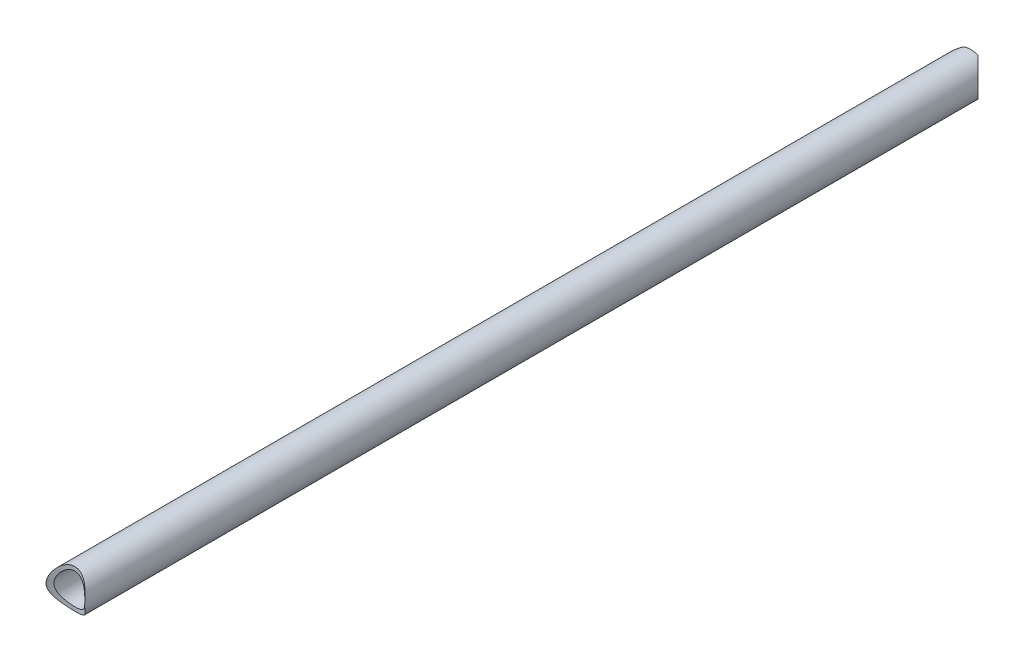
ISO-10303-21;
HEADER;
FILE_DESCRIPTION(('STEP AP214'),'2;1');
FILE_NAME('part.step','',(''),(''),'','','');
FILE_SCHEMA(('AUTOMOTIVE_DESIGN { 1 0 10303 214 1 1 1 1 }'));
ENDSEC;
DATA;
#1=APPLICATION_CONTEXT('core data for automotive mechanical design processes');
#2=APPLICATION_PROTOCOL_DEFINITION('international standard','automotive_design',2000,#1);
#3=PRODUCT_CONTEXT('',#1,'mechanical');
#4=PRODUCT('Part','Part','',(#3));
#5=PRODUCT_RELATED_PRODUCT_CATEGORY('part','',(#4));
#6=PRODUCT_DEFINITION_FORMATION('','',#4);
#7=PRODUCT_DEFINITION_CONTEXT('part definition',#1,'design');
#8=PRODUCT_DEFINITION('design','',#6,#7);
#9=PRODUCT_DEFINITION_SHAPE('','',#8);
#10=(LENGTH_UNIT() NAMED_UNIT(*) SI_UNIT(.MILLI.,.METRE.));
#11=(NAMED_UNIT(*) PLANE_ANGLE_UNIT() SI_UNIT($,.RADIAN.));
#12=(NAMED_UNIT(*) SI_UNIT($,.STERADIAN.) SOLID_ANGLE_UNIT());
#13=UNCERTAINTY_MEASURE_WITH_UNIT(LENGTH_MEASURE(1.E-05),#10,'distance_accuracy_value','');
#14=(GEOMETRIC_REPRESENTATION_CONTEXT(3) GLOBAL_UNCERTAINTY_ASSIGNED_CONTEXT((#13)) GLOBAL_UNIT_ASSIGNED_CONTEXT((#10,
#11,#12)) REPRESENTATION_CONTEXT('',''));
#15=CARTESIAN_POINT('',(0.,0.,0.));
#16=DIRECTION('',(0.,0.,1.));
#17=DIRECTION('',(1.,0.,0.));
#18=AXIS2_PLACEMENT_3D('',#15,#16,#17);
#19=CARTESIAN_POINT('',(6.35,16.7005,6.35));
#20=DIRECTION('',(0.,0.,1.));
#21=DIRECTION('',(1.,0.,0.));
#22=AXIS2_PLACEMENT_3D('',#19,#20,#21);
#23=PLANE('',#22);
#24=CARTESIAN_POINT('',(0.,0.,6.35));
#25=DIRECTION('',(0.,0.,1.));
#26=DIRECTION('',(1.,0.,0.));
#27=AXIS2_PLACEMENT_3D('',#24,#25,#26);
#28=CIRCLE('',#27,16.7005);
#29=CARTESIAN_POINT('',(-6.35,-15.4461710546659,6.35));
#30=VERTEX_POINT('',#29);
#31=CARTESIAN_POINT('',(6.35,-15.4461710546659,6.35));
#32=VERTEX_POINT('',#31);
#33=EDGE_CURVE('E60',#30,#32,#28,.T.);
#34=ORIENTED_EDGE('',*,*,#33,.F.);
#35=DIRECTION('',(1.,0.,0.));
#36=VECTOR('',#35,1.);
#37=CARTESIAN_POINT('',(-16.7005,-15.4461710546659,6.35));
#38=LINE('',#37,#36);
#39=EDGE_CURVE('E38',#32,#30,#38,.F.);
#40=ORIENTED_EDGE('',*,*,#39,.F.);
#41=EDGE_LOOP('',(#34,#40));
#42=FACE_BOUND('',#41,.T.);
#43=ADVANCED_FACE('F16',(#42),#23,.F.);
#44=CARTESIAN_POINT('',(6.35,16.7005,6.35));
#45=DIRECTION('',(0.,0.,1.));
#46=DIRECTION('',(1.,0.,0.));
#47=AXIS2_PLACEMENT_3D('',#44,#45,#46);
#48=PLANE('',#47);
#49=DIRECTION('',(1.,0.,0.));
#50=VECTOR('',#49,1.);
#51=CARTESIAN_POINT('',(-16.7005,15.4461710546659,6.35));
#52=LINE('',#51,#50);
#53=CARTESIAN_POINT('',(-6.35,15.4461710546659,6.35));
#54=VERTEX_POINT('',#53);
#55=CARTESIAN_POINT('',(6.35,15.4461710546659,6.35));
#56=VERTEX_POINT('',#55);
#57=EDGE_CURVE('E46',#54,#56,#52,.T.);
#58=ORIENTED_EDGE('',*,*,#57,.F.);
#59=CARTESIAN_POINT('',(0.,0.,6.35));
#60=DIRECTION('',(0.,0.,1.));
#61=DIRECTION('',(1.,0.,0.));
#62=AXIS2_PLACEMENT_3D('',#59,#60,#61);
#63=CIRCLE('',#62,16.7005);
#64=EDGE_CURVE('E29',#56,#54,#63,.T.);
#65=ORIENTED_EDGE('',*,*,#64,.F.);
#66=EDGE_LOOP('',(#58,#65));
#67=FACE_BOUND('',#66,.T.);
#68=ADVANCED_FACE('F55',(#67),#48,.F.);
#69=CARTESIAN_POINT('',(0.,0.,0.));
#70=DIRECTION('',(0.,0.,1.));
#71=DIRECTION('',(1.,0.,0.));
#72=AXIS2_PLACEMENT_3D('',#69,#70,#71);
#73=CYLINDRICAL_SURFACE('',#72,16.7005);
#74=CARTESIAN_POINT('',(-16.7005,0.,787.233608751868));
#75=CARTESIAN_POINT('',(-16.700501651617,-0.318048689825917,787.233612608257));
#76=CARTESIAN_POINT('',(-16.6913959959469,-0.636078058233083,787.221766271706));
#77=CARTESIAN_POINT('',(-16.6552091317132,-1.26936872938501,787.175000935832));
#78=CARTESIAN_POINT('',(-16.6281288319816,-1.58463017126485,787.140083103047));
#79=CARTESIAN_POINT('',(-16.5565522230821,-2.21059640241424,787.048768533877));
#80=CARTESIAN_POINT('',(-16.5120227972951,-2.52129135473045,786.99233096079));
#81=CARTESIAN_POINT('',(-16.406435560555,-3.13573086215763,786.860411205657));
#82=CARTESIAN_POINT('',(-16.3453749130287,-3.43947421474204,786.78492575536));
#83=CARTESIAN_POINT('',(-16.1842492768174,-4.14084876098794,786.589195163801));
#84=CARTESIAN_POINT('',(-16.077982364405,-4.53524728481024,786.462460291712));
#85=CARTESIAN_POINT('',(-15.8396836474816,-5.30799392340747,786.186396495594));
#86=CARTESIAN_POINT('',(-15.7076417804045,-5.68633569915747,786.037058752514));
#87=CARTESIAN_POINT('',(-15.4192499567053,-6.42743384951331,785.721430967993));
#88=CARTESIAN_POINT('',(-15.2628423194377,-6.79015056507846,785.555101031414));
#89=CARTESIAN_POINT('',(-14.9272840463479,-7.49911362250992,785.210919182502));
#90=CARTESIAN_POINT('',(-14.7481336137038,-7.8453601114789,785.033067373109));
#91=CARTESIAN_POINT('',(-14.3024041651075,-8.6382984028996,784.607526750598));
#92=CARTESIAN_POINT('',(-14.0269775406112,-9.07846296782937,784.356901101039));
#93=CARTESIAN_POINT('',(-13.4378225813671,-9.92973408775896,783.851105361308));
#94=CARTESIAN_POINT('',(-13.1240811814276,-10.3408306548058,783.595933746457));
#95=CARTESIAN_POINT('',(-12.4592472119749,-11.1328767461881,783.08845490054));
#96=CARTESIAN_POINT('',(-12.1081844373138,-11.5138499015276,782.836145559907));
#97=CARTESIAN_POINT('',(-11.3689722747507,-12.2443047785302,782.340633446549));
#98=CARTESIAN_POINT('',(-10.9808349094774,-12.5937966380637,782.097427757041));
#99=CARTESIAN_POINT('',(-10.246856978174,-13.1942295023333,781.671867202713));
#100=CARTESIAN_POINT('',(-9.90742040228809,-13.4511353391158,781.486861072064));
#101=CARTESIAN_POINT('',(-9.2052426848626,-13.9410699521921,781.129778171846));
#102=CARTESIAN_POINT('',(-8.84250262469104,-14.1740998351183,780.957700803138));
#103=CARTESIAN_POINT('',(-8.09505502437905,-14.6138480285564,780.629839586845));
#104=CARTESIAN_POINT('',(-7.71037556823541,-14.8205989295075,780.474035601102));
#105=CARTESIAN_POINT('',(-6.92003928515725,-15.2056855933979,780.181636648248));
#106=CARTESIAN_POINT('',(-6.51438587820199,-15.3840259696791,780.045038562877));
#107=CARTESIAN_POINT('',(-5.75026126756027,-15.683807125484,779.814088012563));
#108=CARTESIAN_POINT('',(-5.39455250044626,-15.8097863364325,779.716471964176));
#109=CARTESIAN_POINT('',(-4.67143177476955,-16.0383338840936,779.53870105387));
#110=CARTESIAN_POINT('',(-4.30402100750052,-16.1409045952257,779.45854442101));
#111=CARTESIAN_POINT('',(-3.55969655452298,-16.3212078930991,779.31724958533));
#112=CARTESIAN_POINT('',(-3.18278649496969,-16.3989498072969,779.25610424075));
#113=CARTESIAN_POINT('',(-2.42180325024312,-16.5284760682203,779.154046874769));
#114=CARTESIAN_POINT('',(-2.03772997888543,-16.5802601024235,779.113135096972));
#115=CARTESIAN_POINT('',(-1.2639485361398,-16.6571543818868,779.052333662823));
#116=CARTESIAN_POINT('',(-0.874225795711782,-16.6821746677361,779.032514906316));
#117=CARTESIAN_POINT('',(-0.0934815880961755,-16.7048039829193,779.014591498827));
#118=CARTESIAN_POINT('',(0.297539881527401,-16.7024129608096,779.016486888595));
#119=CARTESIAN_POINT('',(1.0777582290705,-16.670260832553,779.041948698987));
#120=CARTESIAN_POINT('',(1.46695501820657,-16.6404984082069,779.065516163332));
#121=CARTESIAN_POINT('',(2.24046061871693,-16.5541076339679,779.133793779299));
#122=CARTESIAN_POINT('',(2.6247695313816,-16.4974798417346,779.178503492059));
#123=CARTESIAN_POINT('',(3.36595716497829,-16.3618931457417,779.285247485782));
#124=CARTESIAN_POINT('',(3.72322478696736,-16.2842447345686,779.346262989482));
#125=CARTESIAN_POINT('',(4.42876565574082,-16.1066776484362,779.485295562696));
#126=CARTESIAN_POINT('',(4.77703928705755,-16.0067599273521,779.563311904001));
#127=CARTESIAN_POINT('',(5.46288298696905,-15.7858617455712,779.735014684873));
#128=CARTESIAN_POINT('',(5.80045212790353,-15.6648794652667,779.828702478151));
#129=CARTESIAN_POINT('',(6.46349157949884,-15.4031504972252,780.030269017966));
#130=CARTESIAN_POINT('',(6.78896023061735,-15.2624011110486,780.13814970187));
#131=CARTESIAN_POINT('',(7.45803660736234,-14.9477144408192,780.377759231156));
#132=CARTESIAN_POINT('',(7.80028273182768,-14.771874867815,780.510789894612));
#133=CARTESIAN_POINT('',(8.46779474930284,-14.3996258832921,780.789948530501));
#134=CARTESIAN_POINT('',(8.79305971576122,-14.2032153511039,780.936077216429));
#135=CARTESIAN_POINT('',(9.42603574881754,-13.791272704257,781.239358926914));
#136=CARTESIAN_POINT('',(9.7337397651196,-13.5757329972033,781.396516323554));
#137=CARTESIAN_POINT('',(10.3310355839786,-13.1269183916845,781.719690906607));
#138=CARTESIAN_POINT('',(10.6206253345675,-12.8936414905733,781.885709092827));
#139=CARTESIAN_POINT('',(11.2389465364587,-12.360896534547,782.259242496426));
#140=CARTESIAN_POINT('',(11.5635215076673,-12.0576666498107,782.468284177876));
#141=CARTESIAN_POINT('',(12.1856888122492,-11.4285380286701,782.892400312314));
#142=CARTESIAN_POINT('',(12.483276565549,-11.1026354609469,783.107475781233));
#143=CARTESIAN_POINT('',(13.0514882835474,-10.4287970356688,783.539898685134));
#144=CARTESIAN_POINT('',(13.3220829665062,-10.0808379062256,783.757248310771));
#145=CARTESIAN_POINT('',(13.8355433882296,-9.36370199013703,784.18959328861));
#146=CARTESIAN_POINT('',(14.0784128552644,-8.99452806635247,784.404588953832));
#147=CARTESIAN_POINT('',(14.5090787381798,-8.2792904513633,784.802516138416));
#148=CARTESIAN_POINT('',(14.6999945759619,-7.93555716771788,784.986261646823));
#149=CARTESIAN_POINT('',(15.0589359152759,-7.23127694571284,785.343871395788));
#150=CARTESIAN_POINT('',(15.2269593605258,-6.87072850085056,785.517734747875));
#151=CARTESIAN_POINT('',(15.5386367295555,-6.13330543738908,785.850321277235));
#152=CARTESIAN_POINT('',(15.6823324945151,-5.75646027869634,786.009070239584));
#153=CARTESIAN_POINT('',(15.944006998122,-4.98604647831984,786.305852276331));
#154=CARTESIAN_POINT('',(16.0619965058618,-4.592484922507,786.443894018002));
#155=CARTESIAN_POINT('',(16.2405793140074,-3.90364687412955,786.65723914812));
#156=CARTESIAN_POINT('',(16.307957215658,-3.61219218652718,786.73922737682));
#157=CARTESIAN_POINT('',(16.4275469470861,-3.02208006034204,786.886543316729));
#158=CARTESIAN_POINT('',(16.4797635271719,-2.72342490962231,786.951876245551));
#159=CARTESIAN_POINT('',(16.5680987875878,-2.12070532915112,787.063363065291));
#160=CARTESIAN_POINT('',(16.604244860437,-1.81665102975393,787.109549582514));
#161=CARTESIAN_POINT('',(16.6598377177618,-1.204542646993,787.18092116107));
#162=CARTESIAN_POINT('',(16.6792847988268,-0.896488634766468,787.206106595402));
#163=CARTESIAN_POINT('',(16.7010868754288,-0.27721920419052,787.234357635925));
#164=CARTESIAN_POINT('',(16.7033569139518,0.0340043141999709,787.237313294035));
#165=CARTESIAN_POINT('',(16.6905260764593,0.655473620640881,787.220669011924));
#166=CARTESIAN_POINT('',(16.6754253802914,0.965719418780765,787.20106930523));
#167=CARTESIAN_POINT('',(16.6281800817812,1.58313609121259,787.14022308628));
#168=CARTESIAN_POINT('',(16.596014116721,1.89030261864608,787.098949442725));
#169=CARTESIAN_POINT('',(16.515310333516,2.49911581309074,786.996585629541));
#170=CARTESIAN_POINT('',(16.4667700170888,2.8007616303827,786.935492436038));
#171=CARTESIAN_POINT('',(16.3387002130721,3.47895656814936,786.776687297342));
#172=CARTESIAN_POINT('',(16.2543206410225,3.85331486677389,786.673526126487));
#173=CARTESIAN_POINT('',(16.0622126684386,4.58875099136022,786.444292077627));
#174=CARTESIAN_POINT('',(15.9544766542316,4.94982444176102,786.318211730657));
#175=CARTESIAN_POINT('',(15.7170466761651,5.65872926612367,786.048040659711));
#176=CARTESIAN_POINT('',(15.5873007902475,6.00652688857554,785.903907564068));
#177=CARTESIAN_POINT('',(15.3073659836329,6.68781696743425,785.602496269669));
#178=CARTESIAN_POINT('',(15.1571762718318,7.02130886960294,785.445217562317));
#179=CARTESIAN_POINT('',(14.7692272097316,7.81315039908073,785.052551196056));
#180=CARTESIAN_POINT('',(14.5214022213875,8.26423493376892,784.812408178419));
#181=CARTESIAN_POINT('',(13.9879350069464,9.13819282319567,784.322811330772));
#182=CARTESIAN_POINT('',(13.7022784892393,9.56105542529527,784.073354007798));
#183=CARTESIAN_POINT('',(13.0938498051449,10.3787116126544,783.572530974422));
#184=CARTESIAN_POINT('',(12.7710445709026,10.7734796758603,783.321163752714));
#185=CARTESIAN_POINT('',(12.0890683367024,11.5335054910506,782.823327409082));
#186=CARTESIAN_POINT('',(11.7299026813521,11.8987675659614,782.576857573646));
#187=CARTESIAN_POINT('',(10.9715181600409,12.601687953773,782.092192401959));
#188=CARTESIAN_POINT('',(10.5719158223075,12.9390134279921,781.854112162494));
#189=CARTESIAN_POINT('',(9.73647589874631,13.5788301252783,781.394945742053));
#190=CARTESIAN_POINT('',(9.30063288274637,13.8813161118687,781.173862117374));
#191=CARTESIAN_POINT('',(8.39513210989652,14.4468801952228,780.755224636954));
#192=CARTESIAN_POINT('',(7.92557163567191,14.7100654137341,780.557607132911));
#193=CARTESIAN_POINT('',(7.19731935840765,15.0724532868862,780.282918663177));
#194=CARTESIAN_POINT('',(6.95062350463152,15.1878355139333,780.194990772289));
#195=CARTESIAN_POINT('',(6.44953596791651,15.4073034317559,780.027032514253));
#196=CARTESIAN_POINT('',(6.19514252203695,15.5113865093175,779.947003974415));
#197=CARTESIAN_POINT('',(5.58850270960068,15.742123762028,779.768955814078));
#198=CARTESIAN_POINT('',(5.23330546142896,15.8638435230263,779.674506430721));
#199=CARTESIAN_POINT('',(4.51172820359068,16.0839438789019,779.503094628227));
#200=CARTESIAN_POINT('',(4.14535110562109,16.1823304931231,779.426127699289));
#201=CARTESIAN_POINT('',(3.40359803049756,16.3544205439274,779.291149836295));
#202=CARTESIAN_POINT('',(3.02822692471348,16.4281370324666,779.233128879094));
#203=CARTESIAN_POINT('',(2.27076954163597,16.5498471001216,779.137174343984));
#204=CARTESIAN_POINT('',(1.8886830117786,16.5978397096271,779.099241523256));
#205=CARTESIAN_POINT('',(1.1193828988117,16.6674326009731,779.044196124559));
#206=CARTESIAN_POINT('',(0.732156901736691,16.6889487293993,779.027149933829));
#207=CARTESIAN_POINT('',(-0.0432045049819084,16.7049451075738,779.014479122845));
#208=CARTESIAN_POINT('',(-0.431339910592493,16.6994254769932,779.018854407771));
#209=CARTESIAN_POINT('',(-1.20549610108004,16.6614433499555,779.048929131438));
#210=CARTESIAN_POINT('',(-1.5915166371324,16.628977748906,779.074631027335));
#211=CARTESIAN_POINT('',(-2.35843983195101,16.5376416882991,779.146794200617));
#212=CARTESIAN_POINT('',(-2.7393425623507,16.4787715987203,779.193255187127));
#213=CARTESIAN_POINT('',(-3.47653064006859,16.3387543610254,779.303434384348));
#214=CARTESIAN_POINT('',(-3.8331570341804,16.258715546456,779.366292312291));
#215=CARTESIAN_POINT('',(-4.53720988902332,16.0764627980447,779.508898510042));
#216=CARTESIAN_POINT('',(-4.8846366925106,15.9742496916755,779.588646149579));
#217=CARTESIAN_POINT('',(-5.5686137256899,15.748870531723,779.763680089191));
#218=CARTESIAN_POINT('',(-5.90516299606031,15.625702636043,779.85896775533));
#219=CARTESIAN_POINT('',(-6.56602190545002,15.3597189063707,780.063588890332));
#220=CARTESIAN_POINT('',(-6.89032985410818,15.2169003714472,780.172924289883));
#221=CARTESIAN_POINT('',(-7.55805330288438,14.8974204202017,780.415861280674));
#222=CARTESIAN_POINT('',(-7.90004062352915,14.7187926095879,780.550800624614));
#223=CARTESIAN_POINT('',(-8.56681616378848,14.340963558524,780.833667386893));
#224=CARTESIAN_POINT('',(-8.89160340183402,14.1417611458385,780.981595545196));
#225=CARTESIAN_POINT('',(-9.52343973795524,13.7242214709156,781.288349324557));
#226=CARTESIAN_POINT('',(-9.83048093371341,13.505875791456,781.447179732562));
#227=CARTESIAN_POINT('',(-10.4262683905535,13.0514378494232,781.773542248257));
#228=CARTESIAN_POINT('',(-10.7150125873043,12.8153435909403,781.941075333947));
#229=CARTESIAN_POINT('',(-11.3317154951496,12.2759791897521,782.318011410297));
#230=CARTESIAN_POINT('',(-11.655444297994,11.9689105074742,782.528911424706));
#231=CARTESIAN_POINT('',(-12.2756087170259,11.3319800895008,782.956428882247));
#232=CARTESIAN_POINT('',(-12.5720396115871,11.0021144278968,783.173047306166));
#233=CARTESIAN_POINT('',(-13.1375681650508,10.3202416604379,783.608111241231));
#234=CARTESIAN_POINT('',(-13.4066407690611,9.96821472836115,783.826558232362));
#235=CARTESIAN_POINT('',(-13.9167145117196,9.24274717376765,784.260560360845));
#236=CARTESIAN_POINT('',(-14.1577195765203,8.86930955715949,784.476115898918));
#237=CARTESIAN_POINT('',(-14.5805077214523,8.1525790650235,784.870700908217));
#238=CARTESIAN_POINT('',(-14.7658974121463,7.81197346508017,785.050747900799));
#239=CARTESIAN_POINT('',(-15.1143396634912,7.1144538807924,785.400734012875));
#240=CARTESIAN_POINT('',(-15.2773913017284,6.75753922380286,785.570672714799));
#241=CARTESIAN_POINT('',(-15.579816658445,6.02758956991205,785.895451580473));
#242=CARTESIAN_POINT('',(-15.7192178426184,5.6545739120026,786.050309167878));
#243=CARTESIAN_POINT('',(-15.9094287389788,5.08301798583391,786.267065627613));
#244=CARTESIAN_POINT('',(-15.9696792325822,4.89051213912486,786.336723785502));
#245=CARTESIAN_POINT('',(-16.0836734203298,4.50147299287237,786.470111378934));
#246=CARTESIAN_POINT('',(-16.1374148076491,4.30493829418987,786.53383871075));
#247=CARTESIAN_POINT('',(-16.2706777095569,3.7796058137766,786.69356343936));
#248=CARTESIAN_POINT('',(-16.3443814845616,3.44750739154093,786.783761754577));
#249=CARTESIAN_POINT('',(-16.4719937124611,2.7744151390229,786.941940993125));
#250=CARTESIAN_POINT('',(-16.525909838509,2.43342481185329,787.009930527335));
#251=CARTESIAN_POINT('',(-16.6126379552029,1.74550473979614,787.120172158983));
#252=CARTESIAN_POINT('',(-16.6455042769087,1.39859267761829,787.162490500557));
#253=CARTESIAN_POINT('',(-16.6894329539482,0.701112261556165,787.219204833901));
#254=CARTESIAN_POINT('',(-16.7004981796338,0.350544395109115,787.233604501465));
#255=CARTESIAN_POINT('',(-16.7005,0.,787.233608751868));
#256=B_SPLINE_CURVE_WITH_KNOTS('',3,(#74,#75,#76,#77,#78,#79,#80,#81,#82,#83,#84,#85,#86,#87,
#88,#89,#90,#91,#92,#93,#94,#95,#96,#97,#98,#99,#100,#101,#102,#103,#104,#105,#106,#107,#108,
#109,#110,#111,#112,#113,#114,#115,#116,#117,#118,#119,#120,#121,#122,#123,#124,#125,#126,#127,
#128,#129,#130,#131,#132,#133,#134,#135,#136,#137,#138,#139,#140,#141,#142,#143,#144,#145,#146,
#147,#148,#149,#150,#151,#152,#153,#154,#155,#156,#157,#158,#159,#160,#161,#162,#163,#164,#165,
#166,#167,#168,#169,#170,#171,#172,#173,#174,#175,#176,#177,#178,#179,#180,#181,#182,#183,#184,
#185,#186,#187,#188,#189,#190,#191,#192,#193,#194,#195,#196,#197,#198,#199,#200,#201,#202,#203,
#204,#205,#206,#207,#208,#209,#210,#211,#212,#213,#214,#215,#216,#217,#218,#219,#220,#221,#222,
#223,#224,#225,#226,#227,#228,#229,#230,#231,#232,#233,#234,#235,#236,#237,#238,#239,#240,#241,
#242,#243,#244,#245,#246,#247,#248,#249,#250,#251,#252,#253,#254,#255),.UNSPECIFIED.,.T.,.F.,(4,
2,2,2,2,2,2,2,2,2,2,2,2,2,2,2,2,2,2,2,2,2,2,2,2,2,2,2,2,2,2,2,2,2,2,2,2,2,2,2,2,2,2,2,2,2,2,2,2,
2,2,2,2,2,2,2,2,2,2,2,2,2,2,2,2,2,2,2,2,2,2,2,2,2,2,2,2,2,2,2,2,2,2,2,2,2,2,2,2,2,4),(0.,
0.953770253152081,1.90749228554254,2.86303321846626,3.81873821557277,5.09973719424732,
6.38123727992334,7.66581847596868,8.95038819671194,10.6778456227999,12.4058937587299,
14.1325725533415,15.8586933055416,17.2499206328614,18.641083448647,20.030503791812,
21.4196982884252,22.5878567174351,23.7558966026555,24.923497171723,26.0911117978878,
27.2626388435819,28.4341680879188,29.605753755739,30.7773151053589,31.8881150056961,
32.9988673355987,34.1097156626359,35.2207157810525,36.4409200480069,37.6611908241429,
38.8819481120533,40.102843436769,41.5741835920006,43.0457729868519,44.5189417688889,
45.9919122167756,47.2929955951989,48.5941957649571,49.8931347502231,51.1915285216622,
52.121264909013,53.0507096785082,53.9785640583686,54.9064019583445,55.8388259291543,
56.7712402462134,57.7048245458321,58.638551349594,59.8288195609721,61.0194763578915,
62.2129820427784,63.4065339252722,65.108041707282,66.8101941109069,68.5138735758949,
70.2173029801395,71.9387500756245,73.6604555729236,75.3773790394318,76.2355742662208,
77.093967551391,78.2542294880903,79.4141917810572,80.5735394115764,81.7329307383195,
82.8959976596561,84.0590594327963,85.2222552272382,86.3854347235396,87.4968346849218,
88.6081931795964,89.7196494222657,90.831258584705,92.0563239031349,93.2814590580459,
94.5071356280791,95.732950237894,97.2121251934925,98.691555518279,100.172328736786,
101.652894571865,102.934615973831,104.216390286468,105.496665708338,106.136686065598,
106.776932586249,107.831431092887,108.885520258368,109.936877661342,110.988096632398),.UNSPECIFIED.);
#257=CARTESIAN_POINT('',(-16.7005,0.,787.233608751868));
#258=VERTEX_POINT('',#257);
#259=EDGE_CURVE('E10',#258,#258,#256,.F.);
#260=ORIENTED_EDGE('',*,*,#259,.T.);
#261=EDGE_LOOP('',(#260));
#262=FACE_BOUND('',#261,.T.);
#263=ORIENTED_EDGE('',*,*,#64,.T.);
#264=CARTESIAN_POINT('',(0.,0.,0.));
#265=DIRECTION('',(0.707106781186547,0.,0.707106781186547));
#266=DIRECTION('',(-0.707106781186547,0.,0.707106781186547));
#267=AXIS2_PLACEMENT_3D('',#264,#265,#266);
#268=ELLIPSE('',#267,23.6180735984119,16.7005);
#269=EDGE_CURVE('E53',#54,#30,#268,.T.);
#270=ORIENTED_EDGE('',*,*,#269,.T.);
#271=ORIENTED_EDGE('',*,*,#33,.T.);
#272=CARTESIAN_POINT('',(0.,0.,0.));
#273=DIRECTION('',(-0.707106781186547,0.,0.707106781186547));
#274=DIRECTION('',(0.707106781186547,0.,0.707106781186547));
#275=AXIS2_PLACEMENT_3D('',#272,#273,#274);
#276=ELLIPSE('',#275,23.6180735984119,16.7005);
#277=EDGE_CURVE('E51',#32,#56,#276,.T.);
#278=ORIENTED_EDGE('',*,*,#277,.T.);
#279=EDGE_LOOP('',(#263,#270,#271,#278));
#280=FACE_BOUND('',#279,.T.);
#281=ADVANCED_FACE('F59',(#262,#280),#73,.T.);
#282=CARTESIAN_POINT('',(-16.7005,0.,0.));
#283=DIRECTION('',(1.,0.,0.));
#284=DIRECTION('',(0.,1.,0.));
#285=AXIS2_PLACEMENT_3D('',#282,#283,#284);
#286=CYLINDRICAL_SURFACE('',#285,16.7005);
#287=ORIENTED_EDGE('',*,*,#57,.T.);
#288=ORIENTED_EDGE('',*,*,#277,.F.);
#289=ORIENTED_EDGE('',*,*,#39,.T.);
#290=ORIENTED_EDGE('',*,*,#269,.F.);
#291=EDGE_LOOP('',(#287,#288,#289,#290));
#292=FACE_BOUND('',#291,.T.);
#293=CARTESIAN_POINT('',(0.,13.3223,10.0708998088552));
#294=CARTESIAN_POINT('',(-0.251418143500048,13.3223022843708,10.0708944264897));
#295=CARTESIAN_POINT('',(-0.502811293762377,13.315168722087,10.0803536683972));
#296=CARTESIAN_POINT('',(-1.00339356073241,13.2868247388992,10.117684477375));
#297=CARTESIAN_POINT('',(-1.25258286542488,13.2656155305941,10.1455544583827));
#298=CARTESIAN_POINT('',(-1.74736485458091,13.2095619602766,10.2184279063006));
#299=CARTESIAN_POINT('',(-1.99294933205381,13.1746903626753,10.2634655916618));
#300=CARTESIAN_POINT('',(-2.47865035470144,13.092009190743,10.368725169548));
#301=CARTESIAN_POINT('',(-2.7187650404303,13.0441952858102,10.428952144072));
#302=CARTESIAN_POINT('',(-3.27462578986353,12.9177201172076,10.5854862330085));
#303=CARTESIAN_POINT('',(-3.58776375820543,12.8341105283272,10.6870650225342));
#304=CARTESIAN_POINT('',(-4.20127254631728,12.6465806454139,10.9083321327116));
#305=CARTESIAN_POINT('',(-4.50163821678402,12.5426522523861,11.0280276703168));
#306=CARTESIAN_POINT('',(-5.09001280108556,12.3156449633207,11.2809808387316));
#307=CARTESIAN_POINT('',(-5.37799045091782,12.1925208700848,11.4142702139561));
#308=CARTESIAN_POINT('',(-5.9409332998069,11.9283554466746,11.6900611273794));
#309=CARTESIAN_POINT('',(-6.21589865064837,11.7873143255679,11.8325625580763));
#310=CARTESIAN_POINT('',(-6.84888646199475,11.434618334165,12.1752305414378));
#311=CARTESIAN_POINT('',(-7.20156650728616,11.2157165682894,12.3778414289355));
#312=CARTESIAN_POINT('',(-7.88371776304452,10.7471818668879,12.7867744732474));
#313=CARTESIAN_POINT('',(-8.21318075270778,10.4975381312124,12.9930979124794));
#314=CARTESIAN_POINT('',(-8.84806966939782,9.96824901074906,13.4034616680883));
#315=CARTESIAN_POINT('',(-9.15351433918054,9.68862743019641,13.6075036559608));
#316=CARTESIAN_POINT('',(-9.73930744068202,9.09956019954308,14.0082673204052));
#317=CARTESIAN_POINT('',(-10.0196641269316,8.79012442911118,14.2049913922016));
#318=CARTESIAN_POINT('',(-10.5008423920522,8.20547294017994,14.5488240970278));
#319=CARTESIAN_POINT('',(-10.7064708670409,7.93547114854487,14.6980893235543));
#320=CARTESIAN_POINT('',(-11.0987661821715,7.37682281423736,14.9862576393288));
#321=CARTESIAN_POINT('',(-11.2854366739121,7.08817987972422,15.1251627227251));
#322=CARTESIAN_POINT('',(-11.6379110681395,6.49323527631224,15.3899476900413));
#323=CARTESIAN_POINT('',(-11.8037395993659,6.18695508561283,15.5158429156864));
#324=CARTESIAN_POINT('',(-12.1128258466353,5.55751622852178,15.7522589546384));
#325=CARTESIAN_POINT('',(-12.2560872832031,5.23436035606172,15.8627823018779));
#326=CARTESIAN_POINT('',(-12.4968974840104,4.62605154757629,16.0496316749612));
#327=CARTESIAN_POINT('',(-12.5980925515533,4.34314964550616,16.1285987404772));
#328=CARTESIAN_POINT('',(-12.7819172205302,3.76794233665673,16.2725893221979));
#329=CARTESIAN_POINT('',(-12.8645503449827,3.47563872636244,16.3376154842504));
#330=CARTESIAN_POINT('',(-13.0101137461755,2.88332875196883,16.4524795700261));
#331=CARTESIAN_POINT('',(-13.0730505855828,2.58332498963363,16.5023225525329));
#332=CARTESIAN_POINT('',(-13.1783068439696,1.97748001231232,16.5858302930726));
#333=CARTESIAN_POINT('',(-13.2206260161555,1.67163872749651,16.6194948574494));
#334=CARTESIAN_POINT('',(-13.2840628144823,1.05529732744201,16.6700023126295));
#335=CARTESIAN_POINT('',(-13.3051065163602,0.744784746931296,16.6867865495901));
#336=CARTESIAN_POINT('',(-13.325371652977,0.122591545373589,16.7029492889509));
#337=CARTESIAN_POINT('',(-13.3245930460588,-0.189089077901975,16.7023277581249));
#338=CARTESIAN_POINT('',(-13.3012271283397,-0.811115504501857,16.683693145893));
#339=CARTESIAN_POINT('',(-13.2786390010252,-1.12146125741382,16.6656794133509));
#340=CARTESIAN_POINT('',(-13.2120407141424,-1.73836345548132,16.612664950689));
#341=CARTESIAN_POINT('',(-13.168031033991,-2.04491998528266,16.5776646007317));
#342=CARTESIAN_POINT('',(-13.0622432818108,-2.63564529534352,16.4937638362053));
#343=CARTESIAN_POINT('',(-13.0015491768649,-2.92013092342888,16.4457130572562));
#344=CARTESIAN_POINT('',(-12.8624621699321,-3.48202701063414,16.3359765695346));
#345=CARTESIAN_POINT('',(-12.7840700518669,-3.7594377825245,16.2742914646878));
#346=CARTESIAN_POINT('',(-12.6105537381185,-4.30578333855928,16.1383451030268));
#347=CARTESIAN_POINT('',(-12.5154299542742,-4.57471833113735,16.0640841557603));
#348=CARTESIAN_POINT('',(-12.3094530772396,-5.10308574066137,15.9041330195655));
#349=CARTESIAN_POINT('',(-12.1985942291035,-5.36251463697376,15.8184386496659));
#350=CARTESIAN_POINT('',(-11.9508087552412,-5.89545039377877,15.6281144538284));
#351=CARTESIAN_POINT('',(-11.8123988735205,-6.16789944276703,15.5224553326151));
#352=CARTESIAN_POINT('',(-11.5192374839682,-6.69948001358182,15.3005449586629));
#353=CARTESIAN_POINT('',(-11.3644792235541,-6.95860596618135,15.1842893318531));
#354=CARTESIAN_POINT('',(-11.0398574678804,-7.46291984015718,14.9428810369299));
#355=CARTESIAN_POINT('',(-10.869991320127,-7.70810530156339,14.8177268072643));
#356=CARTESIAN_POINT('',(-10.5162313045658,-8.18416297618829,14.5602004510157));
#357=CARTESIAN_POINT('',(-10.3323355514131,-8.41503325810206,14.4278273550215));
#358=CARTESIAN_POINT('',(-9.91221062050689,-8.90826660816842,14.1297104526471));
#359=CARTESIAN_POINT('',(-9.67299980599334,-9.16733289213351,13.9627053709843));
#360=CARTESIAN_POINT('',(-9.17668619581056,-9.66413138458366,13.6235729971104));
#361=CARTESIAN_POINT('',(-8.91958043166296,-9.90186003845924,13.4514448577919));
#362=CARTESIAN_POINT('',(-8.38798986657652,-10.3560450780743,13.1049871571197));
#363=CARTESIAN_POINT('',(-8.11348561530671,-10.5724769403747,12.9306553128202));
#364=CARTESIAN_POINT('',(-7.54777686996109,-10.98348665511,12.5834042326949));
#365=CARTESIAN_POINT('',(-7.25657445325046,-11.178067217123,12.4104848241972));
#366=CARTESIAN_POINT('',(-6.68818598986024,-11.5261100140998,12.0874292353764));
#367=CARTESIAN_POINT('',(-6.41262328051093,-11.6817425808608,11.9367746667166));
#368=CARTESIAN_POINT('',(-5.84781146813719,-11.9744711681619,11.6430970904509));
#369=CARTESIAN_POINT('',(-5.55856090563278,-12.1115652059752,11.5000749001295));
#370=CARTESIAN_POINT('',(-4.96670188985609,-12.366048087,11.2259728993735));
#371=CARTESIAN_POINT('',(-4.66411729595763,-12.4834704551977,11.0948729487601));
#372=CARTESIAN_POINT('',(-4.04518266334869,-12.697530388079,10.849237822427));
#373=CARTESIAN_POINT('',(-3.72883883549662,-12.7941772160494,10.7346952716757));
#374=CARTESIAN_POINT('',(-3.17897999564318,-12.9395862594659,10.5585380008159));
#375=CARTESIAN_POINT('',(-2.94876385555746,-12.9940455688101,10.4913066307933));
#376=CARTESIAN_POINT('',(-2.48248847766135,-13.0911266038004,10.3699156185401));
#377=CARTESIAN_POINT('',(-2.24643114282424,-13.1337521308253,10.3157517793462));
#378=CARTESIAN_POINT('',(-1.76985020966272,-13.2064109950073,10.2225686839658));
#379=CARTESIAN_POINT('',(-1.52933537855161,-13.2364667736619,10.1835224467864));
#380=CARTESIAN_POINT('',(-1.04489137463389,-13.2834892177118,10.122110644766));
#381=CARTESIAN_POINT('',(-0.800962273048995,-13.3004561557274,10.0997447324999));
#382=CARTESIAN_POINT('',(-0.310169920058765,-13.3209655979565,10.0726796365774));
#383=CARTESIAN_POINT('',(-0.0632978839862854,-13.3244321843177,10.0680803629701));
#384=CARTESIAN_POINT('',(0.429916268091996,-13.3176454396277,10.0770555505642));
#385=CARTESIAN_POINT('',(0.676258391564751,-13.3073923031851,10.0906297539821));
#386=CARTESIAN_POINT('',(1.16668953432507,-13.273394972809,10.1353077709287));
#387=CARTESIAN_POINT('',(1.41077544456562,-13.2496343652269,10.1664329111638));
#388=CARTESIAN_POINT('',(1.89470167325921,-13.1891350878875,10.2447961261987));
#389=CARTESIAN_POINT('',(2.13454133425006,-13.1523944265195,10.2920366736479));
#390=CARTESIAN_POINT('',(2.6704374301383,-13.055444340755,10.4148778875772));
#391=CARTESIAN_POINT('',(2.96488067924532,-12.9916156658253,10.4946596283544));
#392=CARTESIAN_POINT('',(3.54353431865184,-12.8458618316345,10.672568757718));
#393=CARTESIAN_POINT('',(3.82774143977862,-12.7639309495355,10.7707019464271));
#394=CARTESIAN_POINT('',(4.38594703910565,-12.583061599392,10.981465066487));
#395=CARTESIAN_POINT('',(4.65991896444463,-12.4840821897832,11.0941297272674));
#396=CARTESIAN_POINT('',(5.19680621280205,-12.2703048545864,11.3301232830394));
#397=CARTESIAN_POINT('',(5.45972105744587,-12.1555062455121,11.4534526387254));
#398=CARTESIAN_POINT('',(6.0901604480081,-11.855977234073,11.7646791528701));
#399=CARTESIAN_POINT('',(6.4517237201943,-11.6629726111794,11.956729516239));
#400=CARTESIAN_POINT('',(7.15248845881098,-11.2468532321984,12.3489628401912));
#401=CARTESIAN_POINT('',(7.4916808769059,-11.02372640242,12.5491490392044));
#402=CARTESIAN_POINT('',(8.14795348263762,-10.5479343203214,12.9516402580531));
#403=CARTESIAN_POINT('',(8.46501211173738,-10.2952408934804,13.1539471288515));
#404=CARTESIAN_POINT('',(9.07595588785147,-9.76090905635817,13.5551833361622));
#405=CARTESIAN_POINT('',(9.36984458613348,-9.47927509710923,13.7541131865904));
#406=CARTESIAN_POINT('',(9.93683779168635,-8.88337049053275,14.1464256972527));
#407=CARTESIAN_POINT('',(10.2096176292959,-8.56871889612711,14.3397008092336));
#408=CARTESIAN_POINT('',(10.72785141761,-7.91027072875497,14.7131768786703));
#409=CARTESIAN_POINT('',(10.9733011389646,-7.5664696593519,14.8933758110818));
#410=CARTESIAN_POINT('',(11.4332199774544,-6.85166205140229,15.2354190551661));
#411=CARTESIAN_POINT('',(11.6477726953281,-6.48073318353388,15.3973126318188));
#412=CARTESIAN_POINT('',(12.0430648751614,-5.7126635803552,15.6984728805389));
#413=CARTESIAN_POINT('',(12.2238235736237,-5.31553793223444,15.8377524191741));
#414=CARTESIAN_POINT('',(12.4953516830537,-4.63017335700711,16.0484294798648));
#415=CARTESIAN_POINT('',(12.5963283907562,-4.34820053067252,16.1272212815311));
#416=CARTESIAN_POINT('',(12.7798386638517,-3.77490569845396,16.2709568497844));
#417=CARTESIAN_POINT('',(12.8623770210168,-3.48358614416396,16.3359042140728));
#418=CARTESIAN_POINT('',(13.0078678041303,-2.89333645974654,16.4507037098549));
#419=CARTESIAN_POINT('',(13.0708305992168,-2.59441044984049,16.5005638326562));
#420=CARTESIAN_POINT('',(13.1762884157818,-1.99072341644609,16.5842264557447));
#421=CARTESIAN_POINT('',(13.2187826965146,-1.6859621821987,16.6180283748925));
#422=CARTESIAN_POINT('',(13.2827219293065,-1.07174753240303,16.6689336261742));
#423=CARTESIAN_POINT('',(13.3040919429578,-0.762281338595004,16.6859775079832));
#424=CARTESIAN_POINT('',(13.3251538129713,-0.142140924713696,16.7027754092743));
#425=CARTESIAN_POINT('',(13.3248457583348,0.168533290394693,16.7025294997413));
#426=CARTESIAN_POINT('',(13.302556580212,0.788625979462874,16.684753216024));
#427=CARTESIAN_POINT('',(13.2805737344486,1.09804435167167,16.6672214683085));
#428=CARTESIAN_POINT('',(13.2153077585039,1.71317834877015,16.6152638344543));
#429=CARTESIAN_POINT('',(13.1720250434862,2.01889404571105,16.580838277599));
#430=CARTESIAN_POINT('',(13.0676009318225,2.60895435014112,16.4980078323086));
#431=CARTESIAN_POINT('',(13.0074817075329,2.89359424390577,16.4504044893167));
#432=CARTESIAN_POINT('',(12.8695210762881,3.45584951803275,16.3415360588405));
#433=CARTESIAN_POINT('',(12.7916804137679,3.73346519292143,16.2802715452313));
#434=CARTESIAN_POINT('',(12.6192395905063,4.28026388297334,16.1451343474205));
#435=CARTESIAN_POINT('',(12.5246397777822,4.54944707310732,16.0712619250334));
#436=CARTESIAN_POINT('',(12.319682036264,5.07834513386469,15.9120527599764));
#437=CARTESIAN_POINT('',(12.2093183375125,5.3380564936852,15.826711820236));
#438=CARTESIAN_POINT('',(11.9626774379795,5.87131655701233,15.637194789456));
#439=CARTESIAN_POINT('',(11.8249327634228,6.14382340634783,15.531998650958));
#440=CARTESIAN_POINT('',(11.533102341183,6.67557225973808,15.3109891385878));
#441=CARTESIAN_POINT('',(11.3790098443269,6.93480871914063,15.1951713822932));
#442=CARTESIAN_POINT('',(11.0557186899751,7.439392641871,14.9546069955971));
#443=CARTESIAN_POINT('',(10.8865172777513,7.68473755904832,14.8298587377705));
#444=CARTESIAN_POINT('',(10.5340880539812,8.16115706344399,14.5731075176554));
#445=CARTESIAN_POINT('',(10.3508583548459,8.39222972266108,14.4411035797485));
#446=CARTESIAN_POINT('',(9.93228458047714,8.88586217152212,14.1438087565399));
#447=CARTESIAN_POINT('',(9.69396627295112,9.14514133178586,13.9772496445547));
#448=CARTESIAN_POINT('',(9.19946404739434,9.6424343474176,13.6389376575544));
#449=CARTESIAN_POINT('',(8.94327724976108,9.88044476104945,13.4671839479398));
#450=CARTESIAN_POINT('',(8.41359707416459,10.3352328926814,13.1214071778064));
#451=CARTESIAN_POINT('',(8.14008672465545,10.5519892418839,12.9473820287353));
#452=CARTESIAN_POINT('',(7.57641216895627,10.9637345825342,12.6006204241424));
#453=CARTESIAN_POINT('',(7.28624974838458,11.1587259012891,12.4278838326835));
#454=CARTESIAN_POINT('',(6.71834841090567,11.5085877494037,12.1041419056026));
#455=CARTESIAN_POINT('',(6.44215048597992,11.6655161270902,11.9526582077739));
#456=CARTESIAN_POINT('',(5.87599491910139,11.9606981897759,11.6572718657282));
#457=CARTESIAN_POINT('',(5.58603645653188,12.0989507591377,11.5133696747208));
#458=CARTESIAN_POINT('',(4.99232911285808,12.3557602630059,11.2373206419503));
#459=CARTESIAN_POINT('',(4.68859184469421,12.4743334048252,11.1051641688993));
#460=CARTESIAN_POINT('',(4.22265172526182,12.636451723924,10.9194124233361));
#461=CARTESIAN_POINT('',(4.06563112084147,12.6878635336616,10.8595806710955));
#462=CARTESIAN_POINT('',(3.74810285151831,12.7852648682294,10.7447367312496));
#463=CARTESIAN_POINT('',(3.58759383561012,12.8312522462964,10.6897264539806));
#464=CARTESIAN_POINT('',(3.15392994399318,12.9466322556904,10.5500842983709));
#465=CARTESIAN_POINT('',(2.87774279418701,13.0109181280207,10.4704668506329));
#466=CARTESIAN_POINT('',(2.31722139310465,13.1223376259151,10.3304885299927));
#467=CARTESIAN_POINT('',(2.03289086615563,13.1694789614589,10.2701190027191));
#468=CARTESIAN_POINT('',(1.45882116723088,13.2453399364386,10.1720957357507));
#469=CARTESIAN_POINT('',(1.16910286160042,13.2741196587628,10.134367932095));
#470=CARTESIAN_POINT('',(0.586244542694636,13.3125962850914,10.0837758081587));
#471=CARTESIAN_POINT('',(0.293105287088522,13.3222973368622,10.0709060836601));
#472=CARTESIAN_POINT('',(0.,13.3223,10.0708998088552));
#473=B_SPLINE_CURVE_WITH_KNOTS('',3,(#293,#294,#295,#296,#297,#298,#299,#300,#301,#302,#303,
#304,#305,#306,#307,#308,#309,#310,#311,#312,#313,#314,#315,#316,#317,#318,#319,#320,#321,#322,
#323,#324,#325,#326,#327,#328,#329,#330,#331,#332,#333,#334,#335,#336,#337,#338,#339,#340,#341,
#342,#343,#344,#345,#346,#347,#348,#349,#350,#351,#352,#353,#354,#355,#356,#357,#358,#359,#360,
#361,#362,#363,#364,#365,#366,#367,#368,#369,#370,#371,#372,#373,#374,#375,#376,#377,#378,#379,
#380,#381,#382,#383,#384,#385,#386,#387,#388,#389,#390,#391,#392,#393,#394,#395,#396,#397,#398,
#399,#400,#401,#402,#403,#404,#405,#406,#407,#408,#409,#410,#411,#412,#413,#414,#415,#416,#417,
#418,#419,#420,#421,#422,#423,#424,#425,#426,#427,#428,#429,#430,#431,#432,#433,#434,#435,#436,
#437,#438,#439,#440,#441,#442,#443,#444,#445,#446,#447,#448,#449,#450,#451,#452,#453,#454,#455,
#456,#457,#458,#459,#460,#461,#462,#463,#464,#465,#466,#467,#468,#469,#470,#471,#472),
.UNSPECIFIED.,.T.,.F.,(4,2,2,2,2,2,2,2,2,2,2,2,2,2,2,2,2,2,2,2,2,2,2,2,2,2,2,2,2,2,2,2,2,2,2,2,
2,2,2,2,2,2,2,2,2,2,2,2,2,2,2,2,2,2,2,2,2,2,2,2,2,2,2,2,2,2,2,2,2,2,2,2,2,2,2,2,2,2,2,2,2,2,2,2,
2,2,2,2,2,4),(0.,0.753939053734586,1.50781316501342,2.2631978128756,3.01883553173925,
4.03618227752007,5.05393536348487,6.07412203303997,7.09429679948217,8.47822083041247,
9.86263245071176,11.2459527938819,12.6288163059794,13.7401029793392,14.8511751942238,
15.9609218685542,17.0704853925515,18.0015271162719,18.9323919806002,19.8629463561121,
20.7935118700988,21.7272997507215,22.6610894138782,23.5949140379804,24.5287177639432,
25.4122561187822,26.2957553455585,27.1792328286246,28.0630342715602,29.0321340522578,
30.0016356895669,30.9713078796868,31.9411106078913,33.1104957272026,34.2800752927715,
35.4509862542923,36.6217518612506,37.6724993891425,38.7233592075191,39.7724094909819,
40.8209910548434,41.5581972147829,42.2951662864399,43.0308139289689,43.7664462486832,
44.5062093988458,45.2459620558771,45.986615553176,46.7273827429545,47.660926453629,
48.5947657185013,49.5308796623542,50.467034064755,51.8230024334319,53.1795159289033,
54.5373327616513,55.8949410748522,57.2704275281882,58.6461265438158,60.0180303014354,
61.3891507393422,62.3173548010802,63.2453173591015,64.1727875363498,65.1002912757801,
66.0310736546019,66.9618522120029,67.8927047349442,68.8235391150133,69.7069510439299,
70.5903258696842,71.4736823535996,72.3573629995155,73.3253037649047,74.2936457097676,
75.2621645691659,76.2308139783261,77.3984136624844,78.5662019482732,79.7351525400556,
80.9039780174549,81.959003900902,83.0140927806168,84.0683083659166,84.5953177867068,
85.1225350809317,86.0049729715281,86.8870135334627,87.7661528749165,88.6451010674206),.UNSPECIFIED.);
#474=CARTESIAN_POINT('',(0.,13.3223,10.0708998088552));
#475=VERTEX_POINT('',#474);
#476=EDGE_CURVE('E65',#475,#475,#473,.F.);
#477=ORIENTED_EDGE('',*,*,#476,.F.);
#478=EDGE_LOOP('',(#477));
#479=FACE_BOUND('',#478,.T.);
#480=ADVANCED_FACE('F48',(#292,#479),#286,.F.);
#481=CARTESIAN_POINT('',(0.,0.,800.1));
#482=DIRECTION('',(0.,1.,0.));
#483=DIRECTION('',(1.,0.,0.));
#484=AXIS2_PLACEMENT_3D('',#481,#482,#483);
#485=CYLINDRICAL_SURFACE('',#484,21.082);
#486=ORIENTED_EDGE('',*,*,#259,.F.);
#487=EDGE_LOOP('',(#486));
#488=FACE_BOUND('',#487,.T.);
#489=CARTESIAN_POINT('',(-13.3223,0.,783.760873747045));
#490=CARTESIAN_POINT('',(-13.3222973717481,0.330253881623365,783.760869488645));
#491=CARTESIAN_POINT('',(-13.3099961281945,0.660550496552829,783.750817904422));
#492=CARTESIAN_POINT('',(-13.261020887059,1.31827845434101,783.711070501624));
#493=CARTESIAN_POINT('',(-13.2243335813186,1.64570813372473,783.681363956825));
#494=CARTESIAN_POINT('',(-13.1271643400441,2.29551845533995,783.603571813647));
#495=CARTESIAN_POINT('',(-13.0666301363894,2.61788637815018,783.555445849843));
#496=CARTESIAN_POINT('',(-12.9227855057099,3.25450527586383,783.442849817554));
#497=CARTESIAN_POINT('',(-12.8394771041408,3.56875696987667,783.378381202564));
#498=CARTESIAN_POINT('',(-12.6520943413218,4.18459731586657,783.236165356939));
#499=CARTESIAN_POINT('',(-12.5482159158166,4.48627519913903,783.158544343641));
#500=CARTESIAN_POINT('',(-12.3203000151306,5.07885023591913,782.992082513969));
#501=CARTESIAN_POINT('',(-12.1962532745089,5.36974235859697,782.903236544985));
#502=CARTESIAN_POINT('',(-11.9290932455769,5.93965039457843,782.716848022936));
#503=CARTESIAN_POINT('',(-11.7859829931264,6.21866818955006,782.619306855394));
#504=CARTESIAN_POINT('',(-11.4816377796569,6.76411012392338,782.417918516047));
#505=CARTESIAN_POINT('',(-11.3204081542284,7.03053793802658,782.314073204735));
#506=CARTESIAN_POINT('',(-10.9571281738933,7.58616194070119,782.087672257557));
#507=CARTESIAN_POINT('',(-10.7525142186693,7.87343740095405,781.96451005617));
#508=CARTESIAN_POINT('',(-10.3217169704323,8.43028882804762,781.715910595332));
#509=CARTESIAN_POINT('',(-10.0955322923297,8.69986365642404,781.590473190206));
#510=CARTESIAN_POINT('',(-9.62221873631674,9.22065540961449,781.340059542208));
#511=CARTESIAN_POINT('',(-9.37507269773629,9.47185697308972,781.215083766329));
#512=CARTESIAN_POINT('',(-8.86077036898422,9.95463876872878,780.968381362));
#513=CARTESIAN_POINT('',(-8.59361290298251,10.1862178462094,780.846654925046));
#514=CARTESIAN_POINT('',(-8.00558915240873,10.6561223251609,780.59420696938));
#515=CARTESIAN_POINT('',(-7.68217863907032,10.8916921150564,780.464254863294));
#516=CARTESIAN_POINT('',(-7.0124570666165,11.3344724356489,780.215236821698));
#517=CARTESIAN_POINT('',(-6.66614362307133,11.5416800066328,780.096172022754));
#518=CARTESIAN_POINT('',(-5.9527493541643,11.9252807980772,779.8724169139));
#519=CARTESIAN_POINT('',(-5.58568462406122,12.1016974781864,779.767715673494));
#520=CARTESIAN_POINT('',(-4.8330397118537,12.4214526539662,779.575790604589));
#521=CARTESIAN_POINT('',(-4.4474630074704,12.5647973335051,779.488563509142));
#522=CARTESIAN_POINT('',(-3.70165664102298,12.8030636977902,779.342408817405));
#523=CARTESIAN_POINT('',(-3.34292621858884,12.9014589498764,779.281488079432));
#524=CARTESIAN_POINT('',(-2.61597828981686,13.0682573794544,779.177712298765));
#525=CARTESIAN_POINT('',(-2.24776137840824,13.1366624329071,779.134856126095));
#526=CARTESIAN_POINT('',(-1.50548532903383,13.2422656806345,779.068524542593));
#527=CARTESIAN_POINT('',(-1.13143177554685,13.2794920404835,779.045031640069));
#528=CARTESIAN_POINT('',(-0.380812581577292,13.3221587762608,779.018095991201));
#529=CARTESIAN_POINT('',(-0.00424724559357773,13.3276029374136,779.014650857189));
#530=CARTESIAN_POINT('',(0.695953330883639,13.3080667032046,779.02699203583));
#531=CARTESIAN_POINT('',(1.01975773112996,13.2871606260734,779.040203033455));
#532=CARTESIAN_POINT('',(1.66402715479361,13.2219323016746,779.081296581036));
#533=CARTESIAN_POINT('',(1.98449255806734,13.1776127483349,779.109177443094));
#534=CARTESIAN_POINT('',(2.61986861945919,13.0661401715609,779.178977522709));
#535=CARTESIAN_POINT('',(2.93477905025664,12.9989862159664,779.220897313372));
#536=CARTESIAN_POINT('',(3.55702117965748,12.8426708310539,779.317856596572));
#537=CARTESIAN_POINT('',(3.86435255683612,12.7535084701271,779.372896644483));
#538=CARTESIAN_POINT('',(4.47010525139359,12.5540303761235,779.495036999141));
#539=CARTESIAN_POINT('',(4.76851279811626,12.4436837216217,779.56215492615));
#540=CARTESIAN_POINT('',(5.35445531816935,12.2030244901552,779.707069213669));
#541=CARTESIAN_POINT('',(5.64199043344916,12.0727121739725,779.784865434702));
#542=CARTESIAN_POINT('',(6.20499873197546,11.7932375638431,779.949695685209));
#543=CARTESIAN_POINT('',(6.48047116763032,11.6440741038058,780.036730286095));
#544=CARTESIAN_POINT('',(7.01838905820146,11.3279846147506,780.218512002669));
#545=CARTESIAN_POINT('',(7.28083286006884,11.1610563401698,780.313260093024));
#546=CARTESIAN_POINT('',(7.82402051780338,10.7884227095782,780.521177805017));
#547=CARTESIAN_POINT('',(8.10291822229495,10.580480604745,780.635165977734));
#548=CARTESIAN_POINT('',(8.642281884576,10.1446968985864,780.868565863903));
#549=CARTESIAN_POINT('',(8.90274651975535,9.91685387194491,780.987977965525));
#550=CARTESIAN_POINT('',(9.4048180778547,9.44206623984526,781.229973977045));
#551=CARTESIAN_POINT('',(9.6463982357994,9.19509547671534,781.35256207222));
#552=CARTESIAN_POINT('',(10.1095640594373,8.68328987964414,781.598211764139));
#553=CARTESIAN_POINT('',(10.3311491025474,8.41845448990474,781.721273375503));
#554=CARTESIAN_POINT('',(10.7820537906732,7.83483883885309,781.981649553819));
#555=CARTESIAN_POINT('',(11.0083863744818,7.51360023651347,782.118648077115));
#556=CARTESIAN_POINT('',(11.4330050231,6.85019666069531,782.385597999372));
#557=CARTESIAN_POINT('',(11.6312856371546,6.50802763869479,782.51554802573));
#558=CARTESIAN_POINT('',(11.9978397163246,5.80453279938042,782.763579546638));
#559=CARTESIAN_POINT('',(12.1661572917089,5.44323617548836,782.881678374278));
#560=CARTESIAN_POINT('',(12.4711035516601,4.70270327945171,783.101245857886));
#561=CARTESIAN_POINT('',(12.6077460262137,4.32347490093123,783.202721745108));
#562=CARTESIAN_POINT('',(12.8151602163798,3.65287893202658,783.359794018779));
#563=CARTESIAN_POINT('',(12.8937779964249,3.36509253500291,783.420405739544));
#564=CARTESIAN_POINT('',(13.0319163792628,2.78251515616829,783.528109073079));
#565=CARTESIAN_POINT('',(13.0914417269568,2.48772593430861,783.575204044762));
#566=CARTESIAN_POINT('',(13.1905419689764,1.8931463883065,783.654199524871));
#567=CARTESIAN_POINT('',(13.2301403095771,1.59336237237014,783.686117887765));
#568=CARTESIAN_POINT('',(13.2888796297897,0.990489522629234,783.733636879895));
#569=CARTESIAN_POINT('',(13.3080203209502,0.687400642287209,783.749237279049));
#570=CARTESIAN_POINT('',(13.3255427481005,0.0794292046658087,783.763514224425));
#571=CARTESIAN_POINT('',(13.3238703301547,-0.225455967825744,783.76214662138));
#572=CARTESIAN_POINT('',(13.2996644238364,-0.833839252179977,783.742436371875));
#573=CARTESIAN_POINT('',(13.2771308188781,-1.13733735628129,783.724093630546));
#574=CARTESIAN_POINT('',(13.2115570302107,-1.74087828175405,783.671145861034));
#575=CARTESIAN_POINT('',(13.1685020898881,-2.04091845731203,783.636529130691));
#576=CARTESIAN_POINT('',(13.0625392046902,-2.63531739678238,783.552330800904));
#577=CARTESIAN_POINT('',(12.9996307901187,-2.92967602610511,783.502748847412));
#578=CARTESIAN_POINT('',(12.8563674996272,-3.50477054801582,783.391542134632));
#579=CARTESIAN_POINT('',(12.7764190650625,-3.78566336682478,783.330200806832));
#580=CARTESIAN_POINT('',(12.599144751548,-4.33932710489843,783.196610199637));
#581=CARTESIAN_POINT('',(12.5018132167355,-4.61209534690124,783.1243573712));
#582=CARTESIAN_POINT('',(12.2906234495404,-5.14852929035216,782.970833874784));
#583=CARTESIAN_POINT('',(12.1767646284935,-5.41219466716263,782.889562885622));
#584=CARTESIAN_POINT('',(11.9332951230022,-5.92975084234437,782.719861594706));
#585=CARTESIAN_POINT('',(11.8036836780967,-6.18364116804325,782.631430947386));
#586=CARTESIAN_POINT('',(11.5029239437274,-6.72913362104274,782.431609306971));
#587=CARTESIAN_POINT('',(11.3285859790313,-7.01856379524925,782.319079655021));
#588=CARTESIAN_POINT('',(10.9594917166769,-7.58199447449603,782.089238509258));
#589=CARTESIAN_POINT('',(10.7647381159813,-7.85599701023814,781.971927648303));
#590=CARTESIAN_POINT('',(10.3553924989958,-8.388226334448,781.735018507781));
#591=CARTESIAN_POINT('',(10.1407797793224,-8.64643618242603,781.615417946541));
#592=CARTESIAN_POINT('',(9.69260666329289,-9.14601984195228,781.376522735326));
#593=CARTESIAN_POINT('',(9.45904502426635,-9.38739254738683,781.257228105944));
#594=CARTESIAN_POINT('',(8.93247035222628,-9.89187387143336,781.001275613121));
#595=CARTESIAN_POINT('',(8.63609098100274,-10.1517308450039,780.865102500823));
#596=CARTESIAN_POINT('',(8.01943356194568,-10.6455817544551,780.599946896357));
#597=CARTESIAN_POINT('',(7.69915261010091,-10.8795725390296,780.470965281282));
#598=CARTESIAN_POINT('',(7.03614991169012,-11.3196519693037,780.223671087846));
#599=CARTESIAN_POINT('',(6.69343339205546,-11.5257470799232,780.1053560396));
#600=CARTESIAN_POINT('',(5.98730208058997,-11.9078539460845,779.882682507541));
#601=CARTESIAN_POINT('',(5.62388981513474,-12.0838693630709,779.778322325412));
#602=CARTESIAN_POINT('',(4.89922655960897,-12.3946769384233,779.591941385832));
#603=CARTESIAN_POINT('',(4.53895613158444,-12.5312039930199,779.50900761796));
#604=CARTESIAN_POINT('',(3.80460751477242,-12.7733342331778,779.360763230952));
#605=CARTESIAN_POINT('',(3.43052958569899,-12.8789380000613,779.295452280529));
#606=CARTESIAN_POINT('',(2.67223614812084,-13.0573485459357,779.184538771288));
#607=CARTESIAN_POINT('',(2.28803350627429,-13.1301950093474,779.138912368009));
#608=CARTESIAN_POINT('',(1.51283764563675,-13.2419131292438,779.068751729826));
#609=CARTESIAN_POINT('',(1.12184563551013,-13.2807907709874,779.044213779178));
#610=CARTESIAN_POINT('',(0.396711691538316,-13.3205665215959,779.019099371714));
#611=CARTESIAN_POINT('',(0.062931036146876,-13.3263261657489,779.015455971579));
#612=CARTESIAN_POINT('',(-0.603892370287312,-13.3127817398051,779.024014420198));
#613=CARTESIAN_POINT('',(-0.936935206188248,-13.2934807198318,779.036214340666));
#614=CARTESIAN_POINT('',(-1.59967832047812,-13.230099373803,779.076156980158));
#615=CARTESIAN_POINT('',(-1.92937879697249,-13.1860205252032,779.103898772448));
#616=CARTESIAN_POINT('',(-2.58301977612105,-13.0737008799783,779.174255429472));
#617=CARTESIAN_POINT('',(-2.90696017744321,-13.0054596587264,779.216870555588));
#618=CARTESIAN_POINT('',(-3.53386928639774,-12.8489519971483,779.313970804069));
#619=CARTESIAN_POINT('',(-3.83715569177043,-12.7616100220898,779.367904385962));
#620=CARTESIAN_POINT('',(-4.43467632504643,-12.566467367348,779.487450361173));
#621=CARTESIAN_POINT('',(-4.72891094187539,-12.458667568101,779.553062251889));
#622=CARTESIAN_POINT('',(-5.30691428639419,-12.2236524436887,779.694708162863));
#623=CARTESIAN_POINT('',(-5.59068283343495,-12.0964367835916,779.770742362908));
#624=CARTESIAN_POINT('',(-6.14660648832408,-11.8236541138625,779.93186345693));
#625=CARTESIAN_POINT('',(-6.41876015417132,-11.6780848344272,780.016951470393));
#626=CARTESIAN_POINT('',(-6.97755545223907,-11.3539453827574,780.203773444663));
#627=CARTESIAN_POINT('',(-7.26285204708212,-11.1735243285998,780.306320183369));
#628=CARTESIAN_POINT('',(-7.81715853589562,-10.7929954226036,780.518609317396));
#629=CARTESIAN_POINT('',(-8.08616751023949,-10.5928864608237,780.628352118291));
#630=CARTESIAN_POINT('',(-8.60733769653515,-10.1739523255798,780.853050541533));
#631=CARTESIAN_POINT('',(-8.85948237209722,-9.95510924798694,780.968011100059));
#632=CARTESIAN_POINT('',(-9.3459577374605,-9.49988136061224,781.200885229127));
#633=CARTESIAN_POINT('',(-9.58028684869106,-9.26349500004423,781.31879906012));
#634=CARTESIAN_POINT('',(-10.0638774167511,-8.73772590423278,781.572875837519));
#635=CARTESIAN_POINT('',(-10.3101969577276,-8.44568350711919,781.709151001026));
#636=CARTESIAN_POINT('',(-10.7774477235929,-7.84068966071546,781.979013413664));
#637=CARTESIAN_POINT('',(-10.9983743331024,-7.52773442663631,782.112600170527));
#638=CARTESIAN_POINT('',(-11.413511288395,-6.88205710752813,782.373113067832));
#639=CARTESIAN_POINT('',(-11.6077287156062,-6.54934029553107,782.500040968202));
#640=CARTESIAN_POINT('',(-11.967965837925,-5.86522113550441,782.742992311031));
#641=CARTESIAN_POINT('',(-12.1339939917898,-5.51382443445749,782.859019019929));
#642=CARTESIAN_POINT('',(-12.4031995778466,-4.87212975921959,783.052052000929));
#643=CARTESIAN_POINT('',(-12.5121930623016,-4.58516421466627,783.132056661312));
#644=CARTESIAN_POINT('',(-12.7108493712909,-4.00161862602959,783.280356470211));
#645=CARTESIAN_POINT('',(-12.8005122135071,-3.70503859074103,783.348651629437));
#646=CARTESIAN_POINT('',(-12.9592584683353,-3.10443453914113,783.471157981726));
#647=CARTESIAN_POINT('',(-13.0283966475015,-2.80043271872673,783.525406605164));
#648=CARTESIAN_POINT('',(-13.1454307436764,-2.18609602587839,783.618071258725));
#649=CARTESIAN_POINT('',(-13.1933368860209,-1.87576427742477,783.656494909513));
#650=CARTESIAN_POINT('',(-13.2608099678365,-1.30476347587849,783.71088281068));
#651=CARTESIAN_POINT('',(-13.2838391329479,-1.04475813008209,783.729577356341));
#652=CARTESIAN_POINT('',(-13.314587254822,-0.523177730246886,783.754576182155));
#653=CARTESIAN_POINT('',(-13.3223020819034,-0.261602271878012,783.760877120229));
#654=CARTESIAN_POINT('',(-13.3223,0.,783.760873747045));
#655=B_SPLINE_CURVE_WITH_KNOTS('',3,(#489,#490,#491,#492,#493,#494,#495,#496,#497,#498,#499,
#500,#501,#502,#503,#504,#505,#506,#507,#508,#509,#510,#511,#512,#513,#514,#515,#516,#517,#518,
#519,#520,#521,#522,#523,#524,#525,#526,#527,#528,#529,#530,#531,#532,#533,#534,#535,#536,#537,
#538,#539,#540,#541,#542,#543,#544,#545,#546,#547,#548,#549,#550,#551,#552,#553,#554,#555,#556,
#557,#558,#559,#560,#561,#562,#563,#564,#565,#566,#567,#568,#569,#570,#571,#572,#573,#574,#575,
#576,#577,#578,#579,#580,#581,#582,#583,#584,#585,#586,#587,#588,#589,#590,#591,#592,#593,#594,
#595,#596,#597,#598,#599,#600,#601,#602,#603,#604,#605,#606,#607,#608,#609,#610,#611,#612,#613,
#614,#615,#616,#617,#618,#619,#620,#621,#622,#623,#624,#625,#626,#627,#628,#629,#630,#631,#632,
#633,#634,#635,#636,#637,#638,#639,#640,#641,#642,#643,#644,#645,#646,#647,#648,#649,#650,#651,
#652,#653,#654),.UNSPECIFIED.,.T.,.F.,(4,2,2,2,2,2,2,2,2,2,2,2,2,2,2,2,2,2,2,2,2,2,2,2,2,2,2,2,
2,2,2,2,2,2,2,2,2,2,2,2,2,2,2,2,2,2,2,2,2,2,2,2,2,2,2,2,2,2,2,2,2,2,2,2,2,2,2,2,2,2,2,2,2,2,2,2,
2,2,2,2,2,2,4),(0.,0.99046045817734,1.98146188268567,2.97464759884602,3.96774501334083,
4.95180226671978,5.93631288578719,6.92066690878488,7.90473182598748,9.02438253377102,
10.1441051845367,11.264753547153,12.3854678084805,13.6458428856741,14.906349388031,
16.1658912749993,17.4251974591087,18.5543444820934,19.6834208640691,20.8114761804915,
21.9393971440408,22.9124679681093,23.8854268561334,24.8584254676602,25.8314652729675,
26.8059363149263,27.7803946298909,28.7549132522525,29.7295552053655,30.8267040812807,
31.9239316002058,33.0226870395687,34.1214766788142,35.3684519139403,36.6156691159804,
37.861034755611,39.105857193665,40.0182554590256,40.9304267967735,41.8415223422504,
42.7526307339388,43.666110246546,44.5795948643005,45.4937373497393,46.407901463708,
47.3023084243094,48.1970069260918,49.0917373028284,49.9865108900348,51.0538743667212,
52.1210970189644,53.1894450758671,54.2578632517723,55.5073993616509,56.7570875365042,
58.0064855940475,59.2557314603731,60.4362651671889,61.6167766799021,62.7958541622382,
63.9747238508456,64.9749963380366,65.9751470938697,66.9752382189068,67.9753469203119,
68.9348920805795,69.8943959545938,70.8539163823329,71.8135555911607,72.87087478162,
73.9282536145451,74.9866545100524,76.0451490774794,77.2606728509047,78.4764172078045,
79.691838609364,80.9068946522807,81.8577006039631,82.8085056859269,83.7567504197719,
84.7045379819756,85.4888947383857,86.2734629765874),.UNSPECIFIED.);
#656=CARTESIAN_POINT('',(-13.3223,0.,783.760873747045));
#657=VERTEX_POINT('',#656);
#658=EDGE_CURVE('E21',#657,#657,#655,.F.);
#659=ORIENTED_EDGE('',*,*,#658,.F.);
#660=EDGE_LOOP('',(#659));
#661=FACE_BOUND('',#660,.T.);
#662=ADVANCED_FACE('F74',(#488,#661),#485,.F.);
#663=CARTESIAN_POINT('',(0.,0.,0.));
#664=DIRECTION('',(0.,0.,1.));
#665=DIRECTION('',(1.,0.,0.));
#666=AXIS2_PLACEMENT_3D('',#663,#664,#665);
#667=CYLINDRICAL_SURFACE('',#666,13.3223);
#668=ORIENTED_EDGE('',*,*,#476,.T.);
#669=EDGE_LOOP('',(#668));
#670=FACE_BOUND('',#669,.T.);
#671=ORIENTED_EDGE('',*,*,#658,.T.);
#672=EDGE_LOOP('',(#671));
#673=FACE_BOUND('',#672,.T.);
#674=ADVANCED_FACE('F18',(#670,#673),#667,.F.);
#675=CLOSED_SHELL('',(#43,#68,#281,#480,#662,#674));
#676=MANIFOLD_SOLID_BREP('B1',#675);
#677=ADVANCED_BREP_SHAPE_REPRESENTATION('',(#18,#676),#14);
#678=SHAPE_DEFINITION_REPRESENTATION(#9,#677);
ENDSEC;
END-ISO-10303-21;
